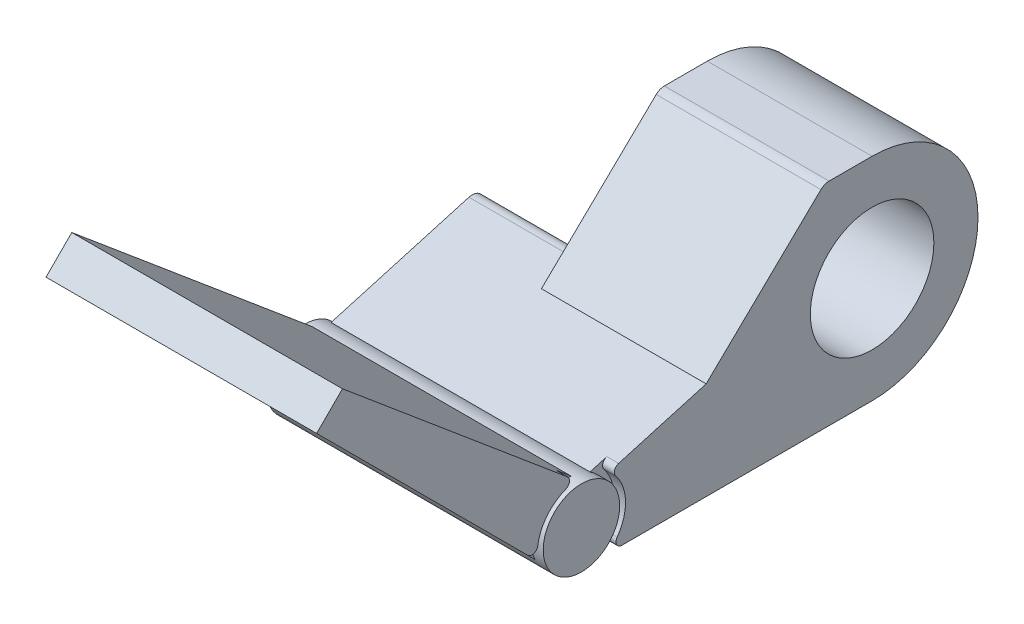
ISO-10303-21;
HEADER;
FILE_DESCRIPTION(('STEP AP214'),'2;1');
FILE_NAME('part.step','',(''),(''),'','','');
FILE_SCHEMA(('AUTOMOTIVE_DESIGN { 1 0 10303 214 1 1 1 1 }'));
ENDSEC;
DATA;
#1=APPLICATION_CONTEXT('core data for automotive mechanical design processes');
#2=APPLICATION_PROTOCOL_DEFINITION('international standard','automotive_design',2000,#1);
#3=PRODUCT_CONTEXT('',#1,'mechanical');
#4=PRODUCT('Part','Part','',(#3));
#5=PRODUCT_RELATED_PRODUCT_CATEGORY('part','',(#4));
#6=PRODUCT_DEFINITION_FORMATION('','',#4);
#7=PRODUCT_DEFINITION_CONTEXT('part definition',#1,'design');
#8=PRODUCT_DEFINITION('design','',#6,#7);
#9=PRODUCT_DEFINITION_SHAPE('','',#8);
#10=(LENGTH_UNIT() NAMED_UNIT(*) SI_UNIT(.MILLI.,.METRE.));
#11=(NAMED_UNIT(*) PLANE_ANGLE_UNIT() SI_UNIT($,.RADIAN.));
#12=(NAMED_UNIT(*) SI_UNIT($,.STERADIAN.) SOLID_ANGLE_UNIT());
#13=UNCERTAINTY_MEASURE_WITH_UNIT(LENGTH_MEASURE(1.E-05),#10,'distance_accuracy_value','');
#14=(GEOMETRIC_REPRESENTATION_CONTEXT(3) GLOBAL_UNCERTAINTY_ASSIGNED_CONTEXT((#13)) GLOBAL_UNIT_ASSIGNED_CONTEXT((#10,
#11,#12)) REPRESENTATION_CONTEXT('',''));
#15=CARTESIAN_POINT('',(0.,0.,0.));
#16=DIRECTION('',(0.,0.,1.));
#17=DIRECTION('',(1.,0.,0.));
#18=AXIS2_PLACEMENT_3D('',#15,#16,#17);
#19=CARTESIAN_POINT('',(-23.,0.,0.));
#20=DIRECTION('',(-1.,0.,0.));
#21=DIRECTION('',(0.,0.,1.));
#22=AXIS2_PLACEMENT_3D('',#19,#20,#21);
#23=PLANE('',#22);
#24=DIRECTION('',(0.,0.,1.));
#25=VECTOR('',#24,1.);
#26=CARTESIAN_POINT('',(-23.,0.,0.));
#27=LINE('',#26,#25);
#28=CARTESIAN_POINT('',(-23.,0.,7.5739201767832));
#29=VERTEX_POINT('',#28);
#30=CARTESIAN_POINT('',(-23.,0.,23.45));
#31=VERTEX_POINT('',#30);
#32=EDGE_CURVE('E459',#29,#31,#27,.T.);
#33=ORIENTED_EDGE('',*,*,#32,.T.);
#34=CARTESIAN_POINT('',(-23.,3.,24.7));
#35=DIRECTION('',(-1.,0.,0.));
#36=DIRECTION('',(0.,0.,1.));
#37=AXIS2_PLACEMENT_3D('',#34,#35,#36);
#38=CIRCLE('',#37,3.25);
#39=CARTESIAN_POINT('',(-23.,5.75491278231233,22.9757739237988));
#40=VERTEX_POINT('',#39);
#41=EDGE_CURVE('E205',#31,#40,#38,.F.);
#42=ORIENTED_EDGE('',*,*,#41,.T.);
#43=DIRECTION('',(0.,0.275637355817,-0.961261695938319));
#44=VECTOR('',#43,1.);
#45=CARTESIAN_POINT('',(-23.,11.4053304118933,3.27042586866501));
#46=LINE('',#45,#44);
#47=CARTESIAN_POINT('',(-23.,9.1144744288069,11.2595901128398));
#48=VERTEX_POINT('',#47);
#49=EDGE_CURVE('E225',#40,#48,#46,.T.);
#50=ORIENTED_EDGE('',*,*,#49,.T.);
#51=CARTESIAN_POINT('',(-23.,8.15321273286858,10.9839527570228));
#52=DIRECTION('',(-1.,0.,0.));
#53=DIRECTION('',(0.,0.,1.));
#54=AXIS2_PLACEMENT_3D('',#51,#52,#53);
#55=CIRCLE('',#54,0.999999999999999);
#56=CARTESIAN_POINT('',(-23.,8.23007778051204,9.98691125114109));
#57=VERTEX_POINT('',#56);
#58=EDGE_CURVE('E229',#57,#48,#55,.F.);
#59=ORIENTED_EDGE('',*,*,#58,.F.);
#60=CARTESIAN_POINT('',(-23.,9.,0.));
#61=DIRECTION('',(-1.,0.,0.));
#62=DIRECTION('',(0.,0.,1.));
#63=AXIS2_PLACEMENT_3D('',#60,#61,#62);
#64=CIRCLE('',#63,10.0165451410269);
#65=CARTESIAN_POINT('',(-23.,1.72618047650956,6.88641605640547));
#66=VERTEX_POINT('',#65);
#67=EDGE_CURVE('E238',#66,#57,#64,.T.);
#68=ORIENTED_EDGE('',*,*,#67,.F.);
#69=CARTESIAN_POINT('',(-23.,0.999999999999997,7.5739201767832));
#70=DIRECTION('',(-1.,0.,0.));
#71=DIRECTION('',(0.,0.,1.));
#72=AXIS2_PLACEMENT_3D('',#69,#70,#71);
#73=CIRCLE('',#72,1.);
#74=EDGE_CURVE('E256',#29,#66,#73,.F.);
#75=ORIENTED_EDGE('',*,*,#74,.F.);
#76=EDGE_LOOP('',(#33,#42,#50,#59,#68,#75));
#77=FACE_BOUND('',#76,.T.);
#78=ADVANCED_FACE('F39',(#77),#23,.T.);
#79=CARTESIAN_POINT('',(0.,0.,0.));
#80=DIRECTION('',(1.,0.,0.));
#81=DIRECTION('',(0.,0.,-1.));
#82=AXIS2_PLACEMENT_3D('',#79,#80,#81);
#83=PLANE('',#82);
#84=CARTESIAN_POINT('',(0.,3.,24.7));
#85=DIRECTION('',(1.,0.,0.));
#86=DIRECTION('',(0.,0.,-1.));
#87=AXIS2_PLACEMENT_3D('',#84,#85,#86);
#88=CIRCLE('',#87,3.25);
#89=CARTESIAN_POINT('',(0.,3.,21.45));
#90=VERTEX_POINT('',#89);
#91=EDGE_CURVE('E395',#90,#90,#88,.T.);
#92=ORIENTED_EDGE('',*,*,#91,.T.);
#93=EDGE_LOOP('',(#92));
#94=FACE_BOUND('',#93,.T.);
#95=ADVANCED_FACE('F522',(#94),#83,.T.);
#96=CARTESIAN_POINT('',(-14.,11.4053304118933,3.27042586866501));
#97=DIRECTION('',(0.,0.961261695938319,0.275637355817));
#98=DIRECTION('',(0.,-0.275637355817,0.961261695938319));
#99=AXIS2_PLACEMENT_3D('',#96,#97,#98);
#100=PLANE('',#99);
#101=DIRECTION('',(0.,-0.275637355817,0.961261695938319));
#102=VECTOR('',#101,1.);
#103=CARTESIAN_POINT('',(-1.,11.4053304118933,3.27042586866501));
#104=LINE('',#103,#102);
#105=CARTESIAN_POINT('',(-1.,6.16564061878095,21.5433957344106));
#106=VERTEX_POINT('',#105);
#107=CARTESIAN_POINT('',(-1.,5.75491278231233,22.9757739237988));
#108=VERTEX_POINT('',#107);
#109=EDGE_CURVE('E289',#106,#108,#104,.T.);
#110=ORIENTED_EDGE('',*,*,#109,.F.);
#111=DIRECTION('',(1.,0.,0.));
#112=VECTOR('',#111,1.);
#113=CARTESIAN_POINT('',(-1.,6.16564061878095,21.5433957344106));
#114=LINE('',#113,#112);
#115=CARTESIAN_POINT('',(0.,6.16564061878095,21.5433957344106));
#116=VERTEX_POINT('',#115);
#117=EDGE_CURVE('E308',#106,#116,#114,.T.);
#118=ORIENTED_EDGE('',*,*,#117,.T.);
#119=DIRECTION('',(0.,-0.275637355817,0.961261695938319));
#120=VECTOR('',#119,1.);
#121=CARTESIAN_POINT('',(0.,11.4053304118933,3.27042586866501));
#122=LINE('',#121,#120);
#123=CARTESIAN_POINT('',(0.,8.3,14.1));
#124=VERTEX_POINT('',#123);
#125=EDGE_CURVE('E400',#124,#116,#122,.T.);
#126=ORIENTED_EDGE('',*,*,#125,.F.);
#127=DIRECTION('',(1.,0.,0.));
#128=VECTOR('',#127,1.);
#129=CARTESIAN_POINT('',(-14.,8.3,14.1));
#130=LINE('',#129,#128);
#131=CARTESIAN_POINT('',(-14.,8.3,14.1));
#132=VERTEX_POINT('',#131);
#133=EDGE_CURVE('E427',#132,#124,#130,.T.);
#134=ORIENTED_EDGE('',*,*,#133,.F.);
#135=DIRECTION('',(0.,0.275637355817,-0.961261695938319));
#136=VECTOR('',#135,1.);
#137=CARTESIAN_POINT('',(-14.,11.4053304118933,3.27042586866501));
#138=LINE('',#137,#136);
#139=CARTESIAN_POINT('',(-14.,9.1144744288069,11.2595901128398));
#140=VERTEX_POINT('',#139);
#141=EDGE_CURVE('E206',#132,#140,#138,.T.);
#142=ORIENTED_EDGE('',*,*,#141,.T.);
#143=DIRECTION('',(1.,0.,0.));
#144=VECTOR('',#143,1.);
#145=CARTESIAN_POINT('',(-23.,9.1144744288069,11.2595901128398));
#146=LINE('',#145,#144);
#147=EDGE_CURVE('E264',#48,#140,#146,.T.);
#148=ORIENTED_EDGE('',*,*,#147,.F.);
#149=ORIENTED_EDGE('',*,*,#49,.F.);
#150=DIRECTION('',(1.,0.,0.));
#151=VECTOR('',#150,1.);
#152=CARTESIAN_POINT('',(-14.,5.75491278231233,22.9757739237988));
#153=LINE('',#152,#151);
#154=EDGE_CURVE('E218',#40,#108,#153,.T.);
#155=ORIENTED_EDGE('',*,*,#154,.T.);
#156=EDGE_LOOP('',(#110,#118,#126,#134,#142,#148,#149,#155));
#157=FACE_BOUND('',#156,.T.);
#158=ADVANCED_FACE('F465',(#157),#100,.T.);
#159=CARTESIAN_POINT('',(-14.,-8.43509110833161,7.07788183794783));
#160=DIRECTION('',(0.,-0.766044443118977,0.642787609686541));
#161=DIRECTION('',(0.,-0.642787609686541,-0.766044443118977));
#162=AXIS2_PLACEMENT_3D('',#159,#160,#161);
#163=PLANE('',#162);
#164=DIRECTION('',(1.,0.,0.));
#165=VECTOR('',#164,1.);
#166=CARTESIAN_POINT('',(-1.,7.3536222202493,25.8941376697241));
#167=LINE('',#166,#165);
#168=CARTESIAN_POINT('',(-1.,7.3536222202493,25.8941376697241));
#169=VERTEX_POINT('',#168);
#170=CARTESIAN_POINT('',(0.,7.3536222202493,25.8941376697241));
#171=VERTEX_POINT('',#170);
#172=EDGE_CURVE('E357',#169,#171,#167,.T.);
#173=ORIENTED_EDGE('',*,*,#172,.F.);
#174=DIRECTION('',(0.,-0.642787609686541,-0.766044443118977));
#175=VECTOR('',#174,1.);
#176=CARTESIAN_POINT('',(-1.,-8.43509110833161,7.07788183794783));
#177=LINE('',#176,#175);
#178=CARTESIAN_POINT('',(-1.,6.24763646957156,24.5760751779959));
#179=VERTEX_POINT('',#178);
#180=EDGE_CURVE('E215',#169,#179,#177,.T.);
#181=ORIENTED_EDGE('',*,*,#180,.T.);
#182=DIRECTION('',(1.,0.,0.));
#183=VECTOR('',#182,1.);
#184=CARTESIAN_POINT('',(-14.,6.24763646957156,24.5760751779959));
#185=LINE('',#184,#183);
#186=CARTESIAN_POINT('',(-23.,6.24763646957156,24.5760751779959));
#187=VERTEX_POINT('',#186);
#188=EDGE_CURVE('E197',#187,#179,#185,.T.);
#189=ORIENTED_EDGE('',*,*,#188,.F.);
#190=DIRECTION('',(0.,-0.642787609686541,-0.766044443118977));
#191=VECTOR('',#190,1.);
#192=CARTESIAN_POINT('',(-23.,-8.43509110833161,7.07788183794783));
#193=LINE('',#192,#191);
#194=CARTESIAN_POINT('',(-23.,23.3920310216783,45.0079689783217));
#195=VERTEX_POINT('',#194);
#196=EDGE_CURVE('E213',#195,#187,#193,.T.);
#197=ORIENTED_EDGE('',*,*,#196,.F.);
#198=DIRECTION('',(1.,0.,0.));
#199=VECTOR('',#198,1.);
#200=CARTESIAN_POINT('',(-14.,23.3920310216783,45.0079689783217));
#201=LINE('',#200,#199);
#202=CARTESIAN_POINT('',(0.,23.3920310216783,45.0079689783217));
#203=VERTEX_POINT('',#202);
#204=EDGE_CURVE('E217',#195,#203,#201,.T.);
#205=ORIENTED_EDGE('',*,*,#204,.T.);
#206=DIRECTION('',(0.,-0.642787609686541,-0.766044443118977));
#207=VECTOR('',#206,1.);
#208=CARTESIAN_POINT('',(0.,-8.43509110833161,7.07788183794783));
#209=LINE('',#208,#207);
#210=EDGE_CURVE('E399',#203,#171,#209,.T.);
#211=ORIENTED_EDGE('',*,*,#210,.T.);
#212=EDGE_LOOP('',(#173,#181,#189,#197,#205,#211));
#213=FACE_BOUND('',#212,.T.);
#214=ADVANCED_FACE('F212',(#213),#163,.F.);
#215=CARTESIAN_POINT('',(0.,9.,0.));
#216=DIRECTION('',(1.,0.,0.));
#217=DIRECTION('',(0.,0.,-1.));
#218=AXIS2_PLACEMENT_3D('',#215,#216,#217);
#219=CIRCLE('',#218,5.25);
#220=CARTESIAN_POINT('',(0.,9.,-5.25));
#221=VERTEX_POINT('',#220);
#222=EDGE_CURVE('E371',#221,#221,#219,.T.);
#223=ORIENTED_EDGE('',*,*,#222,.F.);
#224=EDGE_LOOP('',(#223));
#225=FACE_BOUND('',#224,.T.);
#226=DIRECTION('',(0.,0.,1.));
#227=VECTOR('',#226,1.);
#228=CARTESIAN_POINT('',(0.,18.,0.));
#229=LINE('',#228,#227);
#230=CARTESIAN_POINT('',(0.,18.,0.));
#231=VERTEX_POINT('',#230);
#232=CARTESIAN_POINT('',(0.,18.,3.65132973039637));
#233=VERTEX_POINT('',#232);
#234=EDGE_CURVE('E408',#231,#233,#229,.T.);
#235=ORIENTED_EDGE('',*,*,#234,.T.);
#236=CARTESIAN_POINT('',(0.,17.,3.65132973039637));
#237=DIRECTION('',(1.,0.,0.));
#238=DIRECTION('',(0.,0.,-1.));
#239=AXIS2_PLACEMENT_3D('',#236,#237,#238);
#240=CIRCLE('',#239,1.);
#241=CARTESIAN_POINT('',(0.,17.7193398003386,4.34598810085537));
#242=VERTEX_POINT('',#241);
#243=EDGE_CURVE('E62',#233,#242,#240,.T.);
#244=ORIENTED_EDGE('',*,*,#243,.T.);
#245=DIRECTION('',(0.,-0.694658370458999,0.719339800338649));
#246=VECTOR('',#245,1.);
#247=CARTESIAN_POINT('',(0.,11.3405382418,10.9514304803767));
#248=LINE('',#247,#246);
#249=EDGE_CURVE('E411',#242,#124,#248,.T.);
#250=ORIENTED_EDGE('',*,*,#249,.T.);
#251=ORIENTED_EDGE('',*,*,#125,.T.);
#252=CARTESIAN_POINT('',(0.,5.68500977081179,21.4055770565021));
#253=DIRECTION('',(1.,0.,0.));
#254=DIRECTION('',(0.,0.,-1.));
#255=AXIS2_PLACEMENT_3D('',#252,#253,#254);
#256=CIRCLE('',#255,0.500000000000001);
#257=CARTESIAN_POINT('',(0.,5.36912626836335,21.7931562263254));
#258=VERTEX_POINT('',#257);
#259=EDGE_CURVE('E278',#116,#258,#256,.T.);
#260=ORIENTED_EDGE('',*,*,#259,.T.);
#261=CARTESIAN_POINT('',(0.,3.,24.7));
#262=DIRECTION('',(1.,0.,0.));
#263=DIRECTION('',(0.,0.,-1.));
#264=AXIS2_PLACEMENT_3D('',#261,#262,#263);
#265=CIRCLE('',#264,3.75);
#266=CARTESIAN_POINT('',(0.,0.794117647058821,21.6674131430439));
#267=VERTEX_POINT('',#266);
#268=EDGE_CURVE('E301',#267,#258,#265,.T.);
#269=ORIENTED_EDGE('',*,*,#268,.F.);
#270=CARTESIAN_POINT('',(0.,0.499999999999997,21.2630682287831));
#271=DIRECTION('',(1.,0.,0.));
#272=DIRECTION('',(0.,0.,-1.));
#273=AXIS2_PLACEMENT_3D('',#270,#271,#272);
#274=CIRCLE('',#273,0.5);
#275=CARTESIAN_POINT('',(0.,0.,21.2630682287831));
#276=VERTEX_POINT('',#275);
#277=EDGE_CURVE('E272',#276,#267,#274,.F.);
#278=ORIENTED_EDGE('',*,*,#277,.F.);
#279=DIRECTION('',(0.,0.,1.));
#280=VECTOR('',#279,1.);
#281=CARTESIAN_POINT('',(0.,0.,0.));
#282=LINE('',#281,#280);
#283=CARTESIAN_POINT('',(0.,0.,0.));
#284=VERTEX_POINT('',#283);
#285=EDGE_CURVE('E394',#284,#276,#282,.T.);
#286=ORIENTED_EDGE('',*,*,#285,.F.);
#287=CARTESIAN_POINT('',(0.,9.,0.));
#288=DIRECTION('',(1.,0.,0.));
#289=DIRECTION('',(0.,0.,-1.));
#290=AXIS2_PLACEMENT_3D('',#287,#288,#289);
#291=CIRCLE('',#290,9.);
#292=EDGE_CURVE('E404',#284,#231,#291,.T.);
#293=ORIENTED_EDGE('',*,*,#292,.T.);
#294=EDGE_LOOP('',(#235,#244,#250,#251,#260,#269,#278,#286,#293));
#295=FACE_BOUND('',#294,.T.);
#296=ADVANCED_FACE('F529',(#225,#295),#83,.T.);
#297=CARTESIAN_POINT('',(-14.,34.1999999999999,34.2000000000002));
#298=DIRECTION('',(0.,0.707106781186544,0.707106781186551));
#299=DIRECTION('',(0.,-0.707106781186551,0.707106781186544));
#300=AXIS2_PLACEMENT_3D('',#297,#298,#299);
#301=PLANE('',#300);
#302=DIRECTION('',(0.,-0.707106781186551,0.707106781186544));
#303=VECTOR('',#302,1.);
#304=CARTESIAN_POINT('',(0.,34.1999999999999,34.2000000000002));
#305=LINE('',#304,#303);
#306=CARTESIAN_POINT('',(0.,21.2,47.2));
#307=VERTEX_POINT('',#306);
#308=EDGE_CURVE('E356',#203,#307,#305,.T.);
#309=ORIENTED_EDGE('',*,*,#308,.F.);
#310=ORIENTED_EDGE('',*,*,#204,.F.);
#311=DIRECTION('',(0.,0.707106781186551,-0.707106781186544));
#312=VECTOR('',#311,1.);
#313=CARTESIAN_POINT('',(-23.,34.1999999999999,34.2000000000002));
#314=LINE('',#313,#312);
#315=CARTESIAN_POINT('',(-23.,21.2,47.2));
#316=VERTEX_POINT('',#315);
#317=EDGE_CURVE('E223',#316,#195,#314,.T.);
#318=ORIENTED_EDGE('',*,*,#317,.F.);
#319=DIRECTION('',(1.,0.,0.));
#320=VECTOR('',#319,1.);
#321=CARTESIAN_POINT('',(-14.,21.2,47.2));
#322=LINE('',#321,#320);
#323=EDGE_CURVE('E386',#316,#307,#322,.T.);
#324=ORIENTED_EDGE('',*,*,#323,.T.);
#325=EDGE_LOOP('',(#309,#310,#318,#324));
#326=FACE_BOUND('',#325,.T.);
#327=ADVANCED_FACE('F488',(#326),#301,.T.);
#328=CARTESIAN_POINT('',(-14.,3.,24.7));
#329=DIRECTION('',(1.,0.,0.));
#330=DIRECTION('',(0.,0.,-1.));
#331=AXIS2_PLACEMENT_3D('',#328,#329,#330);
#332=CYLINDRICAL_SURFACE('',#331,3.25);
#333=DIRECTION('',(1.,0.,0.));
#334=VECTOR('',#333,1.);
#335=CARTESIAN_POINT('',(-14.,0.,23.45));
#336=LINE('',#335,#334);
#337=CARTESIAN_POINT('',(-1.,0.,23.45));
#338=VERTEX_POINT('',#337);
#339=EDGE_CURVE('E437',#31,#338,#336,.T.);
#340=ORIENTED_EDGE('',*,*,#339,.T.);
#341=CARTESIAN_POINT('',(-1.,3.,24.7));
#342=DIRECTION('',(1.,0.,0.));
#343=DIRECTION('',(0.,0.,-1.));
#344=AXIS2_PLACEMENT_3D('',#341,#342,#343);
#345=CIRCLE('',#344,3.25);
#346=EDGE_CURVE('E293',#338,#108,#345,.T.);
#347=ORIENTED_EDGE('',*,*,#346,.T.);
#348=ORIENTED_EDGE('',*,*,#154,.F.);
#349=ORIENTED_EDGE('',*,*,#41,.F.);
#350=EDGE_LOOP('',(#340,#347,#348,#349));
#351=FACE_BOUND('',#350,.T.);
#352=ORIENTED_EDGE('',*,*,#188,.T.);
#353=CARTESIAN_POINT('',(-1.,3.,24.7));
#354=DIRECTION('',(1.,0.,0.));
#355=DIRECTION('',(0.,0.,-1.));
#356=AXIS2_PLACEMENT_3D('',#353,#354,#355);
#357=CIRCLE('',#356,3.25);
#358=CARTESIAN_POINT('',(-1.,1.6616341540378,27.6616341540376));
#359=VERTEX_POINT('',#358);
#360=EDGE_CURVE('E334',#179,#359,#357,.T.);
#361=ORIENTED_EDGE('',*,*,#360,.T.);
#362=DIRECTION('',(1.,0.,0.));
#363=VECTOR('',#362,1.);
#364=CARTESIAN_POINT('',(-14.,1.6616341540378,27.6616341540376));
#365=LINE('',#364,#363);
#366=CARTESIAN_POINT('',(-23.,1.6616341540378,27.6616341540376));
#367=VERTEX_POINT('',#366);
#368=EDGE_CURVE('E199',#367,#359,#365,.T.);
#369=ORIENTED_EDGE('',*,*,#368,.F.);
#370=EDGE_CURVE('E192',#187,#367,#38,.F.);
#371=ORIENTED_EDGE('',*,*,#370,.F.);
#372=EDGE_LOOP('',(#352,#361,#369,#371));
#373=FACE_BOUND('',#372,.T.);
#374=CARTESIAN_POINT('',(-23.5,3.,24.7));
#375=DIRECTION('',(-1.,0.,0.));
#376=DIRECTION('',(0.,0.,1.));
#377=AXIS2_PLACEMENT_3D('',#374,#375,#376);
#378=CIRCLE('',#377,3.25);
#379=CARTESIAN_POINT('',(-23.5,3.,27.95));
#380=VERTEX_POINT('',#379);
#381=EDGE_CURVE('E247',#380,#380,#378,.T.);
#382=ORIENTED_EDGE('',*,*,#381,.F.);
#383=EDGE_LOOP('',(#382));
#384=FACE_BOUND('',#383,.T.);
#385=ORIENTED_EDGE('',*,*,#91,.F.);
#386=EDGE_LOOP('',(#385));
#387=FACE_BOUND('',#386,.T.);
#388=ADVANCED_FACE('F194',(#351,#373,#384,#387),#332,.T.);
#389=CARTESIAN_POINT('',(-14.,11.3405382418,10.9514304803767));
#390=DIRECTION('',(0.,0.719339800338649,0.694658370458999));
#391=DIRECTION('',(0.,-0.694658370458999,0.719339800338649));
#392=AXIS2_PLACEMENT_3D('',#389,#390,#391);
#393=PLANE('',#392);
#394=ORIENTED_EDGE('',*,*,#249,.F.);
#395=DIRECTION('',(1.,0.,0.));
#396=VECTOR('',#395,1.);
#397=CARTESIAN_POINT('',(-14.,17.7193398003386,4.34598810085537));
#398=LINE('',#397,#396);
#399=CARTESIAN_POINT('',(-14.,17.7193398003386,4.34598810085537));
#400=VERTEX_POINT('',#399);
#401=EDGE_CURVE('E48',#242,#400,#398,.F.);
#402=ORIENTED_EDGE('',*,*,#401,.T.);
#403=DIRECTION('',(0.,-0.694658370458999,0.719339800338649));
#404=VECTOR('',#403,1.);
#405=CARTESIAN_POINT('',(-14.,11.3405382418,10.9514304803767));
#406=LINE('',#405,#404);
#407=EDGE_CURVE('E379',#400,#132,#406,.T.);
#408=ORIENTED_EDGE('',*,*,#407,.T.);
#409=ORIENTED_EDGE('',*,*,#133,.T.);
#410=EDGE_LOOP('',(#394,#402,#408,#409));
#411=FACE_BOUND('',#410,.T.);
#412=ADVANCED_FACE('F578',(#411),#393,.T.);
#413=CARTESIAN_POINT('',(-14.,18.,0.));
#414=DIRECTION('',(0.,1.,0.));
#415=DIRECTION('',(0.,0.,1.));
#416=AXIS2_PLACEMENT_3D('',#413,#414,#415);
#417=PLANE('',#416);
#418=DIRECTION('',(0.,0.,1.));
#419=VECTOR('',#418,1.);
#420=CARTESIAN_POINT('',(-14.,18.,0.));
#421=LINE('',#420,#419);
#422=CARTESIAN_POINT('',(-14.,18.,0.));
#423=VERTEX_POINT('',#422);
#424=CARTESIAN_POINT('',(-14.,18.,3.65132973039637));
#425=VERTEX_POINT('',#424);
#426=EDGE_CURVE('E375',#423,#425,#421,.T.);
#427=ORIENTED_EDGE('',*,*,#426,.T.);
#428=DIRECTION('',(1.,0.,0.));
#429=VECTOR('',#428,1.);
#430=CARTESIAN_POINT('',(-14.,18.,3.65132973039637));
#431=LINE('',#430,#429);
#432=EDGE_CURVE('E444',#425,#233,#431,.T.);
#433=ORIENTED_EDGE('',*,*,#432,.T.);
#434=ORIENTED_EDGE('',*,*,#234,.F.);
#435=DIRECTION('',(1.,0.,0.));
#436=VECTOR('',#435,1.);
#437=CARTESIAN_POINT('',(-14.,18.,0.));
#438=LINE('',#437,#436);
#439=EDGE_CURVE('E431',#423,#231,#438,.T.);
#440=ORIENTED_EDGE('',*,*,#439,.F.);
#441=EDGE_LOOP('',(#427,#433,#434,#440));
#442=FACE_BOUND('',#441,.T.);
#443=ADVANCED_FACE('F583',(#442),#417,.T.);
#444=CARTESIAN_POINT('',(-14.,9.,0.));
#445=DIRECTION('',(1.,0.,0.));
#446=DIRECTION('',(0.,0.,-1.));
#447=AXIS2_PLACEMENT_3D('',#444,#445,#446);
#448=CYLINDRICAL_SURFACE('',#447,9.);
#449=ORIENTED_EDGE('',*,*,#292,.F.);
#450=DIRECTION('',(1.,0.,0.));
#451=VECTOR('',#450,1.);
#452=CARTESIAN_POINT('',(-14.,0.,0.));
#453=LINE('',#452,#451);
#454=CARTESIAN_POINT('',(-14.,0.,0.));
#455=VERTEX_POINT('',#454);
#456=EDGE_CURVE('E434',#455,#284,#453,.T.);
#457=ORIENTED_EDGE('',*,*,#456,.F.);
#458=CARTESIAN_POINT('',(-14.,9.,0.));
#459=DIRECTION('',(1.,0.,0.));
#460=DIRECTION('',(0.,0.,-1.));
#461=AXIS2_PLACEMENT_3D('',#458,#459,#460);
#462=CIRCLE('',#461,9.);
#463=EDGE_CURVE('E370',#455,#423,#462,.T.);
#464=ORIENTED_EDGE('',*,*,#463,.T.);
#465=ORIENTED_EDGE('',*,*,#439,.T.);
#466=EDGE_LOOP('',(#449,#457,#464,#465));
#467=FACE_BOUND('',#466,.T.);
#468=ADVANCED_FACE('F518',(#467),#448,.T.);
#469=CARTESIAN_POINT('',(-14.,0.,0.));
#470=DIRECTION('',(0.,1.,0.));
#471=DIRECTION('',(0.,0.,1.));
#472=AXIS2_PLACEMENT_3D('',#469,#470,#471);
#473=PLANE('',#472);
#474=ORIENTED_EDGE('',*,*,#285,.T.);
#475=DIRECTION('',(1.,0.,0.));
#476=VECTOR('',#475,1.);
#477=CARTESIAN_POINT('',(-1.,0.,21.2630682287831));
#478=LINE('',#477,#476);
#479=CARTESIAN_POINT('',(-1.,0.,21.2630682287831));
#480=VERTEX_POINT('',#479);
#481=EDGE_CURVE('E297',#480,#276,#478,.T.);
#482=ORIENTED_EDGE('',*,*,#481,.F.);
#483=DIRECTION('',(0.,0.,1.));
#484=VECTOR('',#483,1.);
#485=CARTESIAN_POINT('',(-1.,0.,0.));
#486=LINE('',#485,#484);
#487=EDGE_CURVE('E273',#480,#338,#486,.T.);
#488=ORIENTED_EDGE('',*,*,#487,.T.);
#489=ORIENTED_EDGE('',*,*,#339,.F.);
#490=ORIENTED_EDGE('',*,*,#32,.F.);
#491=DIRECTION('',(1.,0.,0.));
#492=VECTOR('',#491,1.);
#493=CARTESIAN_POINT('',(-23.,0.,7.5739201767832));
#494=LINE('',#493,#492);
#495=CARTESIAN_POINT('',(-14.,0.,7.5739201767832));
#496=VERTEX_POINT('',#495);
#497=EDGE_CURVE('E268',#29,#496,#494,.T.);
#498=ORIENTED_EDGE('',*,*,#497,.T.);
#499=DIRECTION('',(0.,0.,1.));
#500=VECTOR('',#499,1.);
#501=CARTESIAN_POINT('',(-14.,0.,0.));
#502=LINE('',#501,#500);
#503=EDGE_CURVE('E367',#455,#496,#502,.T.);
#504=ORIENTED_EDGE('',*,*,#503,.F.);
#505=ORIENTED_EDGE('',*,*,#456,.T.);
#506=EDGE_LOOP('',(#474,#482,#488,#489,#490,#498,#504,#505));
#507=FACE_BOUND('',#506,.T.);
#508=ADVANCED_FACE('F509',(#507),#473,.F.);
#509=CARTESIAN_POINT('',(-14.,-12.9999999999999,12.9999999999997));
#510=DIRECTION('',(0.,-0.707106781186552,0.707106781186544));
#511=DIRECTION('',(0.,-0.707106781186544,-0.707106781186552));
#512=AXIS2_PLACEMENT_3D('',#509,#510,#511);
#513=PLANE('',#512);
#514=DIRECTION('',(1.,0.,0.));
#515=VECTOR('',#514,1.);
#516=CARTESIAN_POINT('',(-1.,3.25915536642034,29.2591553664201));
#517=LINE('',#516,#515);
#518=CARTESIAN_POINT('',(-1.,3.25915536642034,29.2591553664201));
#519=VERTEX_POINT('',#518);
#520=CARTESIAN_POINT('',(0.,3.25915536642034,29.2591553664201));
#521=VERTEX_POINT('',#520);
#522=EDGE_CURVE('E360',#519,#521,#517,.T.);
#523=ORIENTED_EDGE('',*,*,#522,.T.);
#524=DIRECTION('',(0.,-0.707106781186544,-0.707106781186552));
#525=VECTOR('',#524,1.);
#526=CARTESIAN_POINT('',(0.,-12.9999999999999,12.9999999999997));
#527=LINE('',#526,#525);
#528=EDGE_CURVE('E390',#307,#521,#527,.T.);
#529=ORIENTED_EDGE('',*,*,#528,.F.);
#530=ORIENTED_EDGE('',*,*,#323,.F.);
#531=DIRECTION('',(0.,0.707106781186544,0.707106781186552));
#532=VECTOR('',#531,1.);
#533=CARTESIAN_POINT('',(-23.,-12.9999999999999,12.9999999999997));
#534=LINE('',#533,#532);
#535=EDGE_CURVE('E231',#367,#316,#534,.T.);
#536=ORIENTED_EDGE('',*,*,#535,.F.);
#537=ORIENTED_EDGE('',*,*,#368,.T.);
#538=DIRECTION('',(0.,-0.707106781186544,-0.707106781186552));
#539=VECTOR('',#538,1.);
#540=CARTESIAN_POINT('',(-1.,-12.9999999999999,12.9999999999997));
#541=LINE('',#540,#539);
#542=EDGE_CURVE('E330',#519,#359,#541,.T.);
#543=ORIENTED_EDGE('',*,*,#542,.F.);
#544=EDGE_LOOP('',(#523,#529,#530,#536,#537,#543));
#545=FACE_BOUND('',#544,.T.);
#546=ADVANCED_FACE('F506',(#545),#513,.T.);
#547=CARTESIAN_POINT('',(-14.,9.,0.));
#548=DIRECTION('',(1.,0.,0.));
#549=DIRECTION('',(0.,0.,-1.));
#550=AXIS2_PLACEMENT_3D('',#547,#548,#549);
#551=CYLINDRICAL_SURFACE('',#550,5.25);
#552=CARTESIAN_POINT('',(-14.,9.,0.));
#553=DIRECTION('',(1.,0.,0.));
#554=DIRECTION('',(0.,0.,-1.));
#555=AXIS2_PLACEMENT_3D('',#552,#553,#554);
#556=CIRCLE('',#555,5.25);
#557=CARTESIAN_POINT('',(-14.,9.,-5.25));
#558=VERTEX_POINT('',#557);
#559=EDGE_CURVE('E382',#558,#558,#556,.T.);
#560=CARTESIAN_POINT('',(-14.,9.,-5.25));
#561=CARTESIAN_POINT('',(-13.8541666666667,9.,-5.25));
#562=CARTESIAN_POINT('',(-13.7083333333333,9.,-5.25));
#563=CARTESIAN_POINT('',(-13.4166666666667,9.,-5.25));
#564=CARTESIAN_POINT('',(-13.2708333333333,9.,-5.25));
#565=CARTESIAN_POINT('',(-12.9791666666667,9.,-5.25));
#566=CARTESIAN_POINT('',(-12.8333333333333,9.,-5.25));
#567=CARTESIAN_POINT('',(-12.5416666666667,9.,-5.25));
#568=CARTESIAN_POINT('',(-12.3958333333333,9.,-5.25));
#569=CARTESIAN_POINT('',(-12.1041666666667,9.,-5.25));
#570=CARTESIAN_POINT('',(-11.9583333333333,9.,-5.25));
#571=CARTESIAN_POINT('',(-11.6666666666667,9.,-5.25));
#572=CARTESIAN_POINT('',(-11.5208333333333,9.,-5.25));
#573=CARTESIAN_POINT('',(-11.2291666666667,9.,-5.25));
#574=CARTESIAN_POINT('',(-11.0833333333333,9.,-5.25));
#575=CARTESIAN_POINT('',(-10.7916666666667,9.,-5.25));
#576=CARTESIAN_POINT('',(-10.6458333333333,9.,-5.25));
#577=CARTESIAN_POINT('',(-10.3541666666667,9.,-5.25));
#578=CARTESIAN_POINT('',(-10.2083333333333,9.,-5.25));
#579=CARTESIAN_POINT('',(-9.91666666666667,9.,-5.25));
#580=CARTESIAN_POINT('',(-9.77083333333333,9.,-5.25));
#581=CARTESIAN_POINT('',(-9.47916666666667,9.,-5.25));
#582=CARTESIAN_POINT('',(-9.33333333333333,9.,-5.25));
#583=CARTESIAN_POINT('',(-9.04166666666667,9.,-5.25));
#584=CARTESIAN_POINT('',(-8.89583333333333,9.,-5.25));
#585=CARTESIAN_POINT('',(-8.60416666666667,9.,-5.25));
#586=CARTESIAN_POINT('',(-8.45833333333333,9.,-5.25));
#587=CARTESIAN_POINT('',(-8.16666666666667,9.,-5.25));
#588=CARTESIAN_POINT('',(-8.02083333333333,9.,-5.25));
#589=CARTESIAN_POINT('',(-7.72916666666667,9.,-5.25));
#590=CARTESIAN_POINT('',(-7.58333333333333,9.,-5.25));
#591=CARTESIAN_POINT('',(-7.29166666666667,9.,-5.25));
#592=CARTESIAN_POINT('',(-7.14583333333333,9.,-5.25));
#593=CARTESIAN_POINT('',(-6.85416666666667,9.,-5.25));
#594=CARTESIAN_POINT('',(-6.70833333333333,9.,-5.25));
#595=CARTESIAN_POINT('',(-6.41666666666667,9.,-5.25));
#596=CARTESIAN_POINT('',(-6.27083333333333,9.,-5.25));
#597=CARTESIAN_POINT('',(-5.97916666666667,9.,-5.25));
#598=CARTESIAN_POINT('',(-5.83333333333334,9.,-5.25));
#599=CARTESIAN_POINT('',(-5.54166666666667,9.,-5.25));
#600=CARTESIAN_POINT('',(-5.39583333333333,9.,-5.25));
#601=CARTESIAN_POINT('',(-5.10416666666667,9.,-5.25));
#602=CARTESIAN_POINT('',(-4.95833333333334,9.,-5.25));
#603=CARTESIAN_POINT('',(-4.66666666666667,9.,-5.25));
#604=CARTESIAN_POINT('',(-4.52083333333334,9.,-5.25));
#605=CARTESIAN_POINT('',(-4.22916666666667,9.,-5.25));
#606=CARTESIAN_POINT('',(-4.08333333333334,9.,-5.25));
#607=CARTESIAN_POINT('',(-3.79166666666667,9.,-5.25));
#608=CARTESIAN_POINT('',(-3.64583333333333,9.,-5.25));
#609=CARTESIAN_POINT('',(-3.35416666666667,9.,-5.25));
#610=CARTESIAN_POINT('',(-3.20833333333333,9.,-5.25));
#611=CARTESIAN_POINT('',(-2.91666666666667,9.,-5.25));
#612=CARTESIAN_POINT('',(-2.77083333333334,9.,-5.25));
#613=CARTESIAN_POINT('',(-2.47916666666667,9.,-5.25));
#614=CARTESIAN_POINT('',(-2.33333333333334,9.,-5.25));
#615=CARTESIAN_POINT('',(-2.04166666666667,9.,-5.25));
#616=CARTESIAN_POINT('',(-1.89583333333334,9.,-5.25));
#617=CARTESIAN_POINT('',(-1.60416666666667,9.,-5.25));
#618=CARTESIAN_POINT('',(-1.45833333333333,9.,-5.25));
#619=CARTESIAN_POINT('',(-1.16666666666667,9.,-5.25));
#620=CARTESIAN_POINT('',(-1.02083333333334,9.,-5.25));
#621=CARTESIAN_POINT('',(-0.729166666666669,9.,-5.25));
#622=CARTESIAN_POINT('',(-0.583333333333336,9.,-5.25));
#623=CARTESIAN_POINT('',(-0.291666666666669,9.,-5.25));
#624=CARTESIAN_POINT('',(-0.145833333333335,9.,-5.25));
#625=CARTESIAN_POINT('',(0.,9.,-5.25));
#626=B_SPLINE_CURVE_WITH_KNOTS('',3,(#560,#561,#562,#563,#564,#565,#566,#567,#568,#569,#570,
#571,#572,#573,#574,#575,#576,#577,#578,#579,#580,#581,#582,#583,#584,#585,#586,#587,#588,#589,
#590,#591,#592,#593,#594,#595,#596,#597,#598,#599,#600,#601,#602,#603,#604,#605,#606,#607,#608,
#609,#610,#611,#612,#613,#614,#615,#616,#617,#618,#619,#620,#621,#622,#623,#624,#625),
.UNSPECIFIED.,.F.,.F.,(4,2,2,2,2,2,2,2,2,2,2,2,2,2,2,2,2,2,2,2,2,2,2,2,2,2,2,2,2,2,2,2,4),(0.,
0.4375,0.875000000000001,1.3125,1.75,2.1875,2.625,3.0625,3.5,3.9375,4.375,4.8125,5.25,5.6875,
6.125,6.5625,7.,7.4375,7.875,8.3125,8.75,9.1875,9.625,10.0625,10.5,10.9375,11.375,11.8125,12.25,
12.6875,13.125,13.5625,14.),.UNSPECIFIED.);
#627=EDGE_CURVE('BSEAM508',#558,#221,#626,.T.);
#628=ORIENTED_EDGE('',*,*,#559,.F.);
#629=ORIENTED_EDGE('',*,*,#222,.T.);
#630=ORIENTED_EDGE('',*,*,#627,.T.);
#631=ORIENTED_EDGE('',*,*,#627,.F.);
#632=EDGE_LOOP('',(#628,#630,#629,#631));
#633=FACE_BOUND('',#632,.T.);
#634=ADVANCED_FACE('F508',(#633),#551,.F.);
#635=CARTESIAN_POINT('',(-14.,0.,0.));
#636=DIRECTION('',(1.,0.,0.));
#637=DIRECTION('',(0.,0.,-1.));
#638=AXIS2_PLACEMENT_3D('',#635,#636,#637);
#639=PLANE('',#638);
#640=ORIENTED_EDGE('',*,*,#407,.F.);
#641=CARTESIAN_POINT('',(-14.,17.,3.65132973039637));
#642=DIRECTION('',(1.,0.,0.));
#643=DIRECTION('',(0.,0.,-1.));
#644=AXIS2_PLACEMENT_3D('',#641,#642,#643);
#645=CIRCLE('',#644,1.);
#646=EDGE_CURVE('E11',#400,#425,#645,.F.);
#647=ORIENTED_EDGE('',*,*,#646,.T.);
#648=ORIENTED_EDGE('',*,*,#426,.F.);
#649=ORIENTED_EDGE('',*,*,#463,.F.);
#650=ORIENTED_EDGE('',*,*,#503,.T.);
#651=CARTESIAN_POINT('',(-14.,0.999999999999997,7.5739201767832));
#652=DIRECTION('',(-1.,0.,0.));
#653=DIRECTION('',(0.,0.,1.));
#654=AXIS2_PLACEMENT_3D('',#651,#652,#653);
#655=CIRCLE('',#654,1.);
#656=CARTESIAN_POINT('',(-14.,1.72618047650956,6.88641605640547));
#657=VERTEX_POINT('',#656);
#658=EDGE_CURVE('E243',#496,#657,#655,.F.);
#659=ORIENTED_EDGE('',*,*,#658,.T.);
#660=CARTESIAN_POINT('',(-14.,9.,0.));
#661=DIRECTION('',(-1.,0.,0.));
#662=DIRECTION('',(0.,0.,1.));
#663=AXIS2_PLACEMENT_3D('',#660,#661,#662);
#664=CIRCLE('',#663,10.0165451410269);
#665=CARTESIAN_POINT('',(-14.,8.23007778051204,9.98691125114109));
#666=VERTEX_POINT('',#665);
#667=EDGE_CURVE('E253',#657,#666,#664,.T.);
#668=ORIENTED_EDGE('',*,*,#667,.T.);
#669=CARTESIAN_POINT('',(-14.,8.15321273286858,10.9839527570228));
#670=DIRECTION('',(-1.,0.,0.));
#671=DIRECTION('',(0.,0.,1.));
#672=AXIS2_PLACEMENT_3D('',#669,#670,#671);
#673=CIRCLE('',#672,0.999999999999999);
#674=EDGE_CURVE('E246',#666,#140,#673,.F.);
#675=ORIENTED_EDGE('',*,*,#674,.T.);
#676=ORIENTED_EDGE('',*,*,#141,.F.);
#677=EDGE_LOOP('',(#640,#647,#648,#649,#650,#659,#668,#675,#676));
#678=FACE_BOUND('',#677,.T.);
#679=ORIENTED_EDGE('',*,*,#559,.T.);
#680=EDGE_LOOP('',(#679));
#681=FACE_BOUND('',#680,.T.);
#682=ADVANCED_FACE('F515',(#678,#681),#639,.F.);
#683=CARTESIAN_POINT('',(0.,3.,24.7));
#684=DIRECTION('',(1.,0.,0.));
#685=DIRECTION('',(0.,0.,-1.));
#686=AXIS2_PLACEMENT_3D('',#683,#684,#685);
#687=CIRCLE('',#686,3.75);
#688=CARTESIAN_POINT('',(0.,3.54062537383554,28.4108252727884));
#689=VERTEX_POINT('',#688);
#690=CARTESIAN_POINT('',(0.,6.50347058707925,26.0372336540301));
#691=VERTEX_POINT('',#690);
#692=EDGE_CURVE('E312',#689,#691,#687,.F.);
#693=ORIENTED_EDGE('',*,*,#692,.T.);
#694=CARTESIAN_POINT('',(0.,6.97059999868981,26.2155314745674));
#695=DIRECTION('',(1.,0.,0.));
#696=DIRECTION('',(0.,0.,-1.));
#697=AXIS2_PLACEMENT_3D('',#694,#695,#696);
#698=CIRCLE('',#697,0.500000000000002);
#699=EDGE_CURVE('E326',#691,#171,#698,.T.);
#700=ORIENTED_EDGE('',*,*,#699,.T.);
#701=ORIENTED_EDGE('',*,*,#210,.F.);
#702=ORIENTED_EDGE('',*,*,#308,.T.);
#703=ORIENTED_EDGE('',*,*,#528,.T.);
#704=CARTESIAN_POINT('',(0.,3.61270875701361,28.9056019758269));
#705=DIRECTION('',(1.,0.,0.));
#706=DIRECTION('',(0.,0.,-1.));
#707=AXIS2_PLACEMENT_3D('',#704,#705,#706);
#708=CIRCLE('',#707,0.499999999999999);
#709=EDGE_CURVE('E346',#689,#521,#708,.F.);
#710=ORIENTED_EDGE('',*,*,#709,.F.);
#711=EDGE_LOOP('',(#693,#700,#701,#702,#703,#710));
#712=FACE_BOUND('',#711,.T.);
#713=ADVANCED_FACE('F492',(#712),#83,.T.);
#714=CARTESIAN_POINT('',(-1.,3.,24.7));
#715=DIRECTION('',(1.,0.,0.));
#716=DIRECTION('',(0.,0.,-1.));
#717=AXIS2_PLACEMENT_3D('',#714,#715,#716);
#718=CYLINDRICAL_SURFACE('',#717,3.75);
#719=ORIENTED_EDGE('',*,*,#692,.F.);
#720=DIRECTION('',(1.,0.,0.));
#721=VECTOR('',#720,1.);
#722=CARTESIAN_POINT('',(-1.,3.54062537383554,28.4108252727884));
#723=LINE('',#722,#721);
#724=CARTESIAN_POINT('',(-1.,3.54062537383554,28.4108252727884));
#725=VERTEX_POINT('',#724);
#726=EDGE_CURVE('E342',#725,#689,#723,.T.);
#727=ORIENTED_EDGE('',*,*,#726,.F.);
#728=CARTESIAN_POINT('',(-1.,3.,24.7));
#729=DIRECTION('',(1.,0.,0.));
#730=DIRECTION('',(0.,0.,-1.));
#731=AXIS2_PLACEMENT_3D('',#728,#729,#730);
#732=CIRCLE('',#731,3.75);
#733=CARTESIAN_POINT('',(-1.,6.50347058707925,26.0372336540301));
#734=VERTEX_POINT('',#733);
#735=EDGE_CURVE('E321',#725,#734,#732,.F.);
#736=ORIENTED_EDGE('',*,*,#735,.T.);
#737=DIRECTION('',(1.,0.,0.));
#738=VECTOR('',#737,1.);
#739=CARTESIAN_POINT('',(-1.,6.50347058707925,26.0372336540301));
#740=LINE('',#739,#738);
#741=EDGE_CURVE('E352',#734,#691,#740,.T.);
#742=ORIENTED_EDGE('',*,*,#741,.T.);
#743=EDGE_LOOP('',(#719,#727,#736,#742));
#744=FACE_BOUND('',#743,.T.);
#745=ADVANCED_FACE('F498',(#744),#718,.F.);
#746=CARTESIAN_POINT('',(-1.,6.97059999868981,26.2155314745674));
#747=DIRECTION('',(1.,0.,0.));
#748=DIRECTION('',(0.,0.,-1.));
#749=AXIS2_PLACEMENT_3D('',#746,#747,#748);
#750=CYLINDRICAL_SURFACE('',#749,0.500000000000002);
#751=ORIENTED_EDGE('',*,*,#699,.F.);
#752=ORIENTED_EDGE('',*,*,#741,.F.);
#753=CARTESIAN_POINT('',(-1.,6.97059999868981,26.2155314745674));
#754=DIRECTION('',(1.,0.,0.));
#755=DIRECTION('',(0.,0.,-1.));
#756=AXIS2_PLACEMENT_3D('',#753,#754,#755);
#757=CIRCLE('',#756,0.500000000000002);
#758=EDGE_CURVE('E339',#734,#169,#757,.T.);
#759=ORIENTED_EDGE('',*,*,#758,.T.);
#760=ORIENTED_EDGE('',*,*,#172,.T.);
#761=EDGE_LOOP('',(#751,#752,#759,#760));
#762=FACE_BOUND('',#761,.T.);
#763=ADVANCED_FACE('F496',(#762),#750,.T.);
#764=CARTESIAN_POINT('',(-1.,3.61270875701361,28.9056019758269));
#765=DIRECTION('',(1.,0.,0.));
#766=DIRECTION('',(0.,0.,-1.));
#767=AXIS2_PLACEMENT_3D('',#764,#765,#766);
#768=CYLINDRICAL_SURFACE('',#767,0.499999999999999);
#769=ORIENTED_EDGE('',*,*,#709,.T.);
#770=ORIENTED_EDGE('',*,*,#522,.F.);
#771=CARTESIAN_POINT('',(-1.,3.61270875701361,28.9056019758269));
#772=DIRECTION('',(1.,0.,0.));
#773=DIRECTION('',(0.,0.,-1.));
#774=AXIS2_PLACEMENT_3D('',#771,#772,#773);
#775=CIRCLE('',#774,0.499999999999999);
#776=EDGE_CURVE('E325',#725,#519,#775,.F.);
#777=ORIENTED_EDGE('',*,*,#776,.F.);
#778=ORIENTED_EDGE('',*,*,#726,.T.);
#779=EDGE_LOOP('',(#769,#770,#777,#778));
#780=FACE_BOUND('',#779,.T.);
#781=ADVANCED_FACE('F505',(#780),#768,.T.);
#782=CARTESIAN_POINT('',(-1.,0.,0.));
#783=DIRECTION('',(1.,0.,0.));
#784=DIRECTION('',(0.,0.,-1.));
#785=AXIS2_PLACEMENT_3D('',#782,#783,#784);
#786=PLANE('',#785);
#787=ORIENTED_EDGE('',*,*,#735,.F.);
#788=ORIENTED_EDGE('',*,*,#776,.T.);
#789=ORIENTED_EDGE('',*,*,#542,.T.);
#790=ORIENTED_EDGE('',*,*,#360,.F.);
#791=ORIENTED_EDGE('',*,*,#180,.F.);
#792=ORIENTED_EDGE('',*,*,#758,.F.);
#793=EDGE_LOOP('',(#787,#788,#789,#790,#791,#792));
#794=FACE_BOUND('',#793,.T.);
#795=ADVANCED_FACE('F502',(#794),#786,.T.);
#796=CARTESIAN_POINT('',(-1.,5.68500977081179,21.4055770565021));
#797=DIRECTION('',(1.,0.,0.));
#798=DIRECTION('',(0.,0.,-1.));
#799=AXIS2_PLACEMENT_3D('',#796,#797,#798);
#800=CYLINDRICAL_SURFACE('',#799,0.500000000000001);
#801=ORIENTED_EDGE('',*,*,#259,.F.);
#802=ORIENTED_EDGE('',*,*,#117,.F.);
#803=CARTESIAN_POINT('',(-1.,5.68500977081179,21.4055770565021));
#804=DIRECTION('',(1.,0.,0.));
#805=DIRECTION('',(0.,0.,-1.));
#806=AXIS2_PLACEMENT_3D('',#803,#804,#805);
#807=CIRCLE('',#806,0.500000000000001);
#808=CARTESIAN_POINT('',(-1.,5.36912626836335,21.7931562263254));
#809=VERTEX_POINT('',#808);
#810=EDGE_CURVE('E286',#106,#809,#807,.T.);
#811=ORIENTED_EDGE('',*,*,#810,.T.);
#812=DIRECTION('',(1.,0.,0.));
#813=VECTOR('',#812,1.);
#814=CARTESIAN_POINT('',(-1.,5.36912626836335,21.7931562263254));
#815=LINE('',#814,#813);
#816=EDGE_CURVE('E313',#809,#258,#815,.T.);
#817=ORIENTED_EDGE('',*,*,#816,.T.);
#818=EDGE_LOOP('',(#801,#802,#811,#817));
#819=FACE_BOUND('',#818,.T.);
#820=ADVANCED_FACE('F551',(#819),#800,.T.);
#821=CARTESIAN_POINT('',(-1.,3.,24.7));
#822=DIRECTION('',(1.,0.,0.));
#823=DIRECTION('',(0.,0.,-1.));
#824=AXIS2_PLACEMENT_3D('',#821,#822,#823);
#825=CYLINDRICAL_SURFACE('',#824,3.75);
#826=ORIENTED_EDGE('',*,*,#268,.T.);
#827=ORIENTED_EDGE('',*,*,#816,.F.);
#828=CARTESIAN_POINT('',(-1.,3.,24.7));
#829=DIRECTION('',(1.,0.,0.));
#830=DIRECTION('',(0.,0.,-1.));
#831=AXIS2_PLACEMENT_3D('',#828,#829,#830);
#832=CIRCLE('',#831,3.75);
#833=CARTESIAN_POINT('',(-1.,0.794117647058821,21.6674131430439));
#834=VERTEX_POINT('',#833);
#835=EDGE_CURVE('E282',#834,#809,#832,.T.);
#836=ORIENTED_EDGE('',*,*,#835,.F.);
#837=DIRECTION('',(1.,0.,0.));
#838=VECTOR('',#837,1.);
#839=CARTESIAN_POINT('',(-1.,0.794117647058821,21.6674131430439));
#840=LINE('',#839,#838);
#841=EDGE_CURVE('E316',#834,#267,#840,.T.);
#842=ORIENTED_EDGE('',*,*,#841,.T.);
#843=EDGE_LOOP('',(#826,#827,#836,#842));
#844=FACE_BOUND('',#843,.T.);
#845=ADVANCED_FACE('F554',(#844),#825,.F.);
#846=CARTESIAN_POINT('',(-1.,0.499999999999997,21.2630682287831));
#847=DIRECTION('',(1.,0.,0.));
#848=DIRECTION('',(0.,0.,-1.));
#849=AXIS2_PLACEMENT_3D('',#846,#847,#848);
#850=CYLINDRICAL_SURFACE('',#849,0.5);
#851=ORIENTED_EDGE('',*,*,#277,.T.);
#852=ORIENTED_EDGE('',*,*,#841,.F.);
#853=CARTESIAN_POINT('',(-1.,0.499999999999997,21.2630682287831));
#854=DIRECTION('',(1.,0.,0.));
#855=DIRECTION('',(0.,0.,-1.));
#856=AXIS2_PLACEMENT_3D('',#853,#854,#855);
#857=CIRCLE('',#856,0.5);
#858=EDGE_CURVE('E277',#480,#834,#857,.F.);
#859=ORIENTED_EDGE('',*,*,#858,.F.);
#860=ORIENTED_EDGE('',*,*,#481,.T.);
#861=EDGE_LOOP('',(#851,#852,#859,#860));
#862=FACE_BOUND('',#861,.T.);
#863=ADVANCED_FACE('F549',(#862),#850,.T.);
#864=CARTESIAN_POINT('',(-1.,0.,0.));
#865=DIRECTION('',(1.,0.,0.));
#866=DIRECTION('',(0.,0.,-1.));
#867=AXIS2_PLACEMENT_3D('',#864,#865,#866);
#868=PLANE('',#867);
#869=ORIENTED_EDGE('',*,*,#487,.F.);
#870=ORIENTED_EDGE('',*,*,#858,.T.);
#871=ORIENTED_EDGE('',*,*,#835,.T.);
#872=ORIENTED_EDGE('',*,*,#810,.F.);
#873=ORIENTED_EDGE('',*,*,#109,.T.);
#874=ORIENTED_EDGE('',*,*,#346,.F.);
#875=EDGE_LOOP('',(#869,#870,#871,#872,#873,#874));
#876=FACE_BOUND('',#875,.T.);
#877=ADVANCED_FACE('F546',(#876),#868,.T.);
#878=CARTESIAN_POINT('',(-23.,0.999999999999997,7.5739201767832));
#879=DIRECTION('',(1.,0.,0.));
#880=DIRECTION('',(0.,0.,-1.));
#881=AXIS2_PLACEMENT_3D('',#878,#879,#880);
#882=CYLINDRICAL_SURFACE('',#881,1.);
#883=ORIENTED_EDGE('',*,*,#658,.F.);
#884=ORIENTED_EDGE('',*,*,#497,.F.);
#885=ORIENTED_EDGE('',*,*,#74,.T.);
#886=DIRECTION('',(1.,0.,0.));
#887=VECTOR('',#886,1.);
#888=CARTESIAN_POINT('',(-23.,1.72618047650956,6.88641605640547));
#889=LINE('',#888,#887);
#890=EDGE_CURVE('E242',#66,#657,#889,.T.);
#891=ORIENTED_EDGE('',*,*,#890,.T.);
#892=EDGE_LOOP('',(#883,#884,#885,#891));
#893=FACE_BOUND('',#892,.T.);
#894=ADVANCED_FACE('F478',(#893),#882,.T.);
#895=CARTESIAN_POINT('',(-23.,8.15321273286858,10.9839527570228));
#896=DIRECTION('',(1.,0.,0.));
#897=DIRECTION('',(0.,0.,-1.));
#898=AXIS2_PLACEMENT_3D('',#895,#896,#897);
#899=CYLINDRICAL_SURFACE('',#898,0.999999999999999);
#900=ORIENTED_EDGE('',*,*,#674,.F.);
#901=DIRECTION('',(1.,0.,0.));
#902=VECTOR('',#901,1.);
#903=CARTESIAN_POINT('',(-23.,8.23007778051204,9.98691125114109));
#904=LINE('',#903,#902);
#905=EDGE_CURVE('E260',#57,#666,#904,.T.);
#906=ORIENTED_EDGE('',*,*,#905,.F.);
#907=ORIENTED_EDGE('',*,*,#58,.T.);
#908=ORIENTED_EDGE('',*,*,#147,.T.);
#909=EDGE_LOOP('',(#900,#906,#907,#908));
#910=FACE_BOUND('',#909,.T.);
#911=ADVANCED_FACE('F470',(#910),#899,.T.);
#912=CARTESIAN_POINT('',(-23.,9.,0.));
#913=DIRECTION('',(1.,0.,0.));
#914=DIRECTION('',(0.,0.,-1.));
#915=AXIS2_PLACEMENT_3D('',#912,#913,#914);
#916=CYLINDRICAL_SURFACE('',#915,10.0165451410269);
#917=ORIENTED_EDGE('',*,*,#667,.F.);
#918=ORIENTED_EDGE('',*,*,#890,.F.);
#919=ORIENTED_EDGE('',*,*,#67,.T.);
#920=ORIENTED_EDGE('',*,*,#905,.T.);
#921=EDGE_LOOP('',(#917,#918,#919,#920));
#922=FACE_BOUND('',#921,.T.);
#923=ADVANCED_FACE('F474',(#922),#916,.F.);
#924=ORIENTED_EDGE('',*,*,#196,.T.);
#925=ORIENTED_EDGE('',*,*,#370,.T.);
#926=ORIENTED_EDGE('',*,*,#535,.T.);
#927=ORIENTED_EDGE('',*,*,#317,.T.);
#928=EDGE_LOOP('',(#924,#925,#926,#927));
#929=FACE_BOUND('',#928,.T.);
#930=ADVANCED_FACE('F221',(#929),#23,.T.);
#931=CARTESIAN_POINT('',(-23.5,0.,0.));
#932=DIRECTION('',(-1.,0.,0.));
#933=DIRECTION('',(0.,0.,1.));
#934=AXIS2_PLACEMENT_3D('',#931,#932,#933);
#935=PLANE('',#934);
#936=ORIENTED_EDGE('',*,*,#381,.T.);
#937=EDGE_LOOP('',(#936));
#938=FACE_BOUND('',#937,.T.);
#939=ADVANCED_FACE('F533',(#938),#935,.T.);
#940=CARTESIAN_POINT('',(-14.,17.,3.65132973039637));
#941=DIRECTION('',(1.,0.,0.));
#942=DIRECTION('',(0.,0.,-1.));
#943=AXIS2_PLACEMENT_3D('',#940,#941,#942);
#944=CYLINDRICAL_SURFACE('',#943,1.);
#945=ORIENTED_EDGE('',*,*,#646,.F.);
#946=ORIENTED_EDGE('',*,*,#401,.F.);
#947=ORIENTED_EDGE('',*,*,#243,.F.);
#948=ORIENTED_EDGE('',*,*,#432,.F.);
#949=EDGE_LOOP('',(#945,#946,#947,#948));
#950=FACE_BOUND('',#949,.T.);
#951=ADVANCED_FACE('F41',(#950),#944,.T.);
#952=CLOSED_SHELL('',(#78,#95,#158,#214,#296,#327,#388,#412,#443,#468,#508,#546,#634,#682,#713,
#745,#763,#781,#795,#820,#845,#863,#877,#894,#911,#923,#930,#939,#951));
#953=MANIFOLD_SOLID_BREP('B2',#952);
#954=ADVANCED_BREP_SHAPE_REPRESENTATION('',(#18,#953),#14);
#955=SHAPE_DEFINITION_REPRESENTATION(#9,#954);
ENDSEC;
END-ISO-10303-21;
